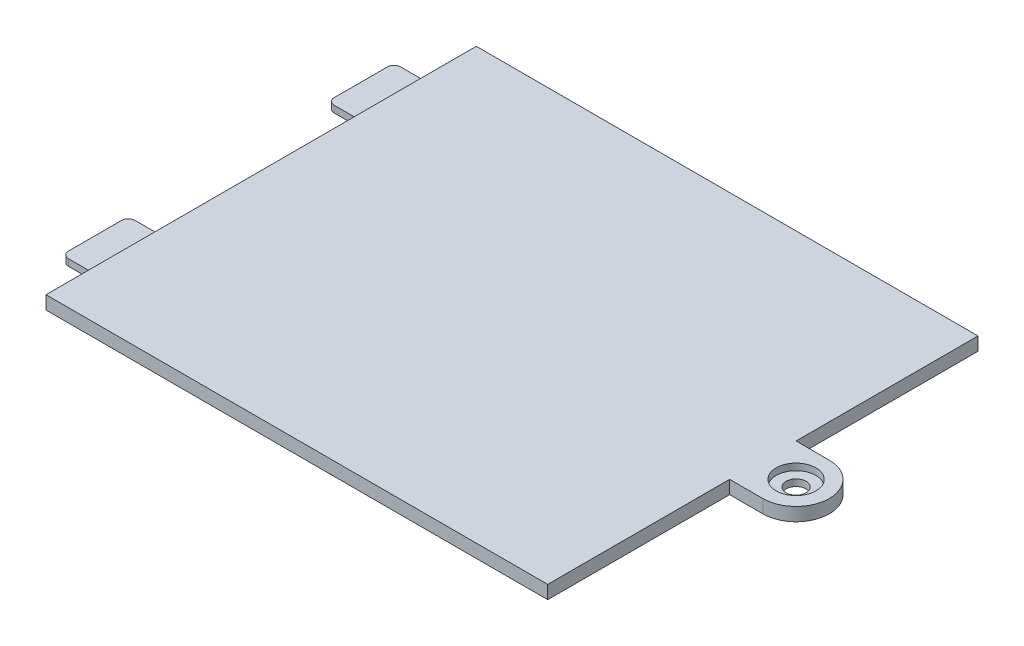
ISO-10303-21;
HEADER;
FILE_DESCRIPTION(('STEP AP214'),'2;1');
FILE_NAME('part.step','',(''),(''),'','','');
FILE_SCHEMA(('AUTOMOTIVE_DESIGN { 1 0 10303 214 1 1 1 1 }'));
ENDSEC;
DATA;
#1=APPLICATION_CONTEXT('core data for automotive mechanical design processes');
#2=APPLICATION_PROTOCOL_DEFINITION('international standard','automotive_design',2000,#1);
#3=PRODUCT_CONTEXT('',#1,'mechanical');
#4=PRODUCT('Part','Part','',(#3));
#5=PRODUCT_RELATED_PRODUCT_CATEGORY('part','',(#4));
#6=PRODUCT_DEFINITION_FORMATION('','',#4);
#7=PRODUCT_DEFINITION_CONTEXT('part definition',#1,'design');
#8=PRODUCT_DEFINITION('design','',#6,#7);
#9=PRODUCT_DEFINITION_SHAPE('','',#8);
#10=(LENGTH_UNIT() NAMED_UNIT(*) SI_UNIT(.MILLI.,.METRE.));
#11=(NAMED_UNIT(*) PLANE_ANGLE_UNIT() SI_UNIT($,.RADIAN.));
#12=(NAMED_UNIT(*) SI_UNIT($,.STERADIAN.) SOLID_ANGLE_UNIT());
#13=UNCERTAINTY_MEASURE_WITH_UNIT(LENGTH_MEASURE(1.E-05),#10,'distance_accuracy_value','');
#14=(GEOMETRIC_REPRESENTATION_CONTEXT(3) GLOBAL_UNCERTAINTY_ASSIGNED_CONTEXT((#13)) GLOBAL_UNIT_ASSIGNED_CONTEXT((#10,
#11,#12)) REPRESENTATION_CONTEXT('',''));
#15=CARTESIAN_POINT('',(0.,0.,0.));
#16=DIRECTION('',(0.,0.,1.));
#17=DIRECTION('',(1.,0.,0.));
#18=AXIS2_PLACEMENT_3D('',#15,#16,#17);
#19=CARTESIAN_POINT('',(42.76,-4.24264068711929,0.));
#20=DIRECTION('',(0.,1.,0.));
#21=DIRECTION('',(0.,0.,1.));
#22=AXIS2_PLACEMENT_3D('',#19,#20,#21);
#23=CYLINDRICAL_SURFACE('',#22,1.5);
#24=CARTESIAN_POINT('',(42.76,0.,0.));
#25=DIRECTION('',(0.,1.,0.));
#26=DIRECTION('',(0.,0.,1.));
#27=AXIS2_PLACEMENT_3D('',#24,#25,#26);
#28=CIRCLE('',#27,1.5);
#29=CARTESIAN_POINT('',(42.76,0.,1.5));
#30=VERTEX_POINT('',#29);
#31=EDGE_CURVE('E208',#30,#30,#28,.F.);
#32=CARTESIAN_POINT('',(42.76,1.,0.));
#33=DIRECTION('',(0.,1.,0.));
#34=DIRECTION('',(0.,0.,1.));
#35=AXIS2_PLACEMENT_3D('',#32,#33,#34);
#36=CIRCLE('',#35,1.5);
#37=CARTESIAN_POINT('',(42.76,1.,1.5));
#38=VERTEX_POINT('',#37);
#39=EDGE_CURVE('E430',#38,#38,#36,.T.);
#40=CARTESIAN_POINT('',(42.76,0.,1.5));
#41=CARTESIAN_POINT('',(42.76,0.0104166666666658,1.5));
#42=CARTESIAN_POINT('',(42.76,0.0208333333333325,1.5));
#43=CARTESIAN_POINT('',(42.76,0.0416666666666658,1.5));
#44=CARTESIAN_POINT('',(42.76,0.0520833333333325,1.5));
#45=CARTESIAN_POINT('',(42.76,0.0729166666666659,1.5));
#46=CARTESIAN_POINT('',(42.76,0.0833333333333325,1.5));
#47=CARTESIAN_POINT('',(42.76,0.104166666666666,1.5));
#48=CARTESIAN_POINT('',(42.76,0.114583333333333,1.5));
#49=CARTESIAN_POINT('',(42.76,0.135416666666666,1.5));
#50=CARTESIAN_POINT('',(42.76,0.145833333333333,1.5));
#51=CARTESIAN_POINT('',(42.76,0.166666666666666,1.5));
#52=CARTESIAN_POINT('',(42.76,0.177083333333333,1.5));
#53=CARTESIAN_POINT('',(42.76,0.197916666666666,1.5));
#54=CARTESIAN_POINT('',(42.76,0.208333333333333,1.5));
#55=CARTESIAN_POINT('',(42.76,0.229166666666666,1.5));
#56=CARTESIAN_POINT('',(42.76,0.239583333333333,1.5));
#57=CARTESIAN_POINT('',(42.76,0.260416666666666,1.5));
#58=CARTESIAN_POINT('',(42.76,0.270833333333333,1.5));
#59=CARTESIAN_POINT('',(42.76,0.291666666666666,1.5));
#60=CARTESIAN_POINT('',(42.76,0.302083333333333,1.5));
#61=CARTESIAN_POINT('',(42.76,0.322916666666666,1.5));
#62=CARTESIAN_POINT('',(42.76,0.333333333333333,1.5));
#63=CARTESIAN_POINT('',(42.76,0.354166666666666,1.5));
#64=CARTESIAN_POINT('',(42.76,0.364583333333333,1.5));
#65=CARTESIAN_POINT('',(42.76,0.385416666666666,1.5));
#66=CARTESIAN_POINT('',(42.76,0.395833333333333,1.5));
#67=CARTESIAN_POINT('',(42.76,0.416666666666666,1.5));
#68=CARTESIAN_POINT('',(42.76,0.427083333333333,1.5));
#69=CARTESIAN_POINT('',(42.76,0.447916666666666,1.5));
#70=CARTESIAN_POINT('',(42.76,0.458333333333333,1.5));
#71=CARTESIAN_POINT('',(42.76,0.479166666666666,1.5));
#72=CARTESIAN_POINT('',(42.76,0.489583333333333,1.5));
#73=CARTESIAN_POINT('',(42.76,0.510416666666666,1.5));
#74=CARTESIAN_POINT('',(42.76,0.520833333333333,1.5));
#75=CARTESIAN_POINT('',(42.76,0.541666666666666,1.5));
#76=CARTESIAN_POINT('',(42.76,0.552083333333333,1.5));
#77=CARTESIAN_POINT('',(42.76,0.572916666666666,1.5));
#78=CARTESIAN_POINT('',(42.76,0.583333333333333,1.5));
#79=CARTESIAN_POINT('',(42.76,0.604166666666666,1.5));
#80=CARTESIAN_POINT('',(42.76,0.614583333333333,1.5));
#81=CARTESIAN_POINT('',(42.76,0.635416666666666,1.5));
#82=CARTESIAN_POINT('',(42.76,0.645833333333333,1.5));
#83=CARTESIAN_POINT('',(42.76,0.666666666666666,1.5));
#84=CARTESIAN_POINT('',(42.76,0.677083333333333,1.5));
#85=CARTESIAN_POINT('',(42.76,0.697916666666666,1.5));
#86=CARTESIAN_POINT('',(42.76,0.708333333333333,1.5));
#87=CARTESIAN_POINT('',(42.76,0.729166666666667,1.5));
#88=CARTESIAN_POINT('',(42.76,0.739583333333333,1.5));
#89=CARTESIAN_POINT('',(42.76,0.760416666666667,1.5));
#90=CARTESIAN_POINT('',(42.76,0.770833333333333,1.5));
#91=CARTESIAN_POINT('',(42.76,0.791666666666667,1.5));
#92=CARTESIAN_POINT('',(42.76,0.802083333333333,1.5));
#93=CARTESIAN_POINT('',(42.76,0.822916666666667,1.5));
#94=CARTESIAN_POINT('',(42.76,0.833333333333333,1.5));
#95=CARTESIAN_POINT('',(42.76,0.854166666666667,1.5));
#96=CARTESIAN_POINT('',(42.76,0.864583333333333,1.5));
#97=CARTESIAN_POINT('',(42.76,0.885416666666667,1.5));
#98=CARTESIAN_POINT('',(42.76,0.895833333333333,1.5));
#99=CARTESIAN_POINT('',(42.76,0.916666666666667,1.5));
#100=CARTESIAN_POINT('',(42.76,0.927083333333333,1.5));
#101=CARTESIAN_POINT('',(42.76,0.947916666666667,1.5));
#102=CARTESIAN_POINT('',(42.76,0.958333333333333,1.5));
#103=CARTESIAN_POINT('',(42.76,0.979166666666667,1.5));
#104=CARTESIAN_POINT('',(42.76,0.989583333333333,1.5));
#105=CARTESIAN_POINT('',(42.76,1.,1.5));
#106=B_SPLINE_CURVE_WITH_KNOTS('',3,(#40,#41,#42,#43,#44,#45,#46,#47,#48,#49,#50,#51,#52,#53,
#54,#55,#56,#57,#58,#59,#60,#61,#62,#63,#64,#65,#66,#67,#68,#69,#70,#71,#72,#73,#74,#75,#76,#77,
#78,#79,#80,#81,#82,#83,#84,#85,#86,#87,#88,#89,#90,#91,#92,#93,#94,#95,#96,#97,#98,#99,#100,
#101,#102,#103,#104,#105),.UNSPECIFIED.,.F.,.F.,(4,2,2,2,2,2,2,2,2,2,2,2,2,2,2,2,2,2,2,2,2,2,2,
2,2,2,2,2,2,2,2,2,4),(0.,0.03125,0.0625000000000001,0.0937500000000001,0.125,0.15625,0.1875,
0.21875,0.25,0.28125,0.3125,0.34375,0.375,0.40625,0.4375,0.46875,0.5,0.53125,0.5625,
0.593750000000001,0.625000000000001,0.656250000000001,0.687500000000001,0.718750000000001,
0.750000000000001,0.781250000000001,0.812500000000001,0.843750000000001,0.875000000000001,
0.906250000000001,0.937500000000001,0.968750000000001,1.),.UNSPECIFIED.);
#107=EDGE_CURVE('BSEAM38',#30,#38,#106,.T.);
#108=ORIENTED_EDGE('',*,*,#31,.T.);
#109=ORIENTED_EDGE('',*,*,#39,.T.);
#110=ORIENTED_EDGE('',*,*,#107,.T.);
#111=ORIENTED_EDGE('',*,*,#107,.F.);
#112=EDGE_LOOP('',(#108,#110,#109,#111));
#113=FACE_BOUND('',#112,.T.);
#114=ADVANCED_FACE('F38',(#113),#23,.F.);
#115=CARTESIAN_POINT('',(-37.76,2.,32.385));
#116=DIRECTION('',(1.,0.,0.));
#117=DIRECTION('',(0.,0.,-1.));
#118=AXIS2_PLACEMENT_3D('',#115,#116,#117);
#119=PLANE('',#118);
#120=DIRECTION('',(0.,1.,0.));
#121=VECTOR('',#120,1.);
#122=CARTESIAN_POINT('',(-37.76,0.,25.));
#123=LINE('',#122,#121);
#124=CARTESIAN_POINT('',(-37.76,0.,25.));
#125=VERTEX_POINT('',#124);
#126=CARTESIAN_POINT('',(-37.76,1.,25.));
#127=VERTEX_POINT('',#126);
#128=EDGE_CURVE('E180',#125,#127,#123,.T.);
#129=ORIENTED_EDGE('',*,*,#128,.F.);
#130=DIRECTION('',(0.,0.,1.));
#131=VECTOR('',#130,1.);
#132=CARTESIAN_POINT('',(-37.76,0.,32.385));
#133=LINE('',#132,#131);
#134=CARTESIAN_POINT('',(-37.76,0.,32.385));
#135=VERTEX_POINT('',#134);
#136=EDGE_CURVE('E190',#125,#135,#133,.T.);
#137=ORIENTED_EDGE('',*,*,#136,.T.);
#138=DIRECTION('',(0.,-1.,0.));
#139=VECTOR('',#138,1.);
#140=CARTESIAN_POINT('',(-37.76,2.,32.385));
#141=LINE('',#140,#139);
#142=CARTESIAN_POINT('',(-37.76,2.,32.385));
#143=VERTEX_POINT('',#142);
#144=EDGE_CURVE('E336',#143,#135,#141,.T.);
#145=ORIENTED_EDGE('',*,*,#144,.F.);
#146=DIRECTION('',(0.,0.,1.));
#147=VECTOR('',#146,1.);
#148=CARTESIAN_POINT('',(-37.76,2.,32.385));
#149=LINE('',#148,#147);
#150=CARTESIAN_POINT('',(-37.76,2.,-32.385));
#151=VERTEX_POINT('',#150);
#152=EDGE_CURVE('E298',#151,#143,#149,.T.);
#153=ORIENTED_EDGE('',*,*,#152,.F.);
#154=DIRECTION('',(0.,-1.,0.));
#155=VECTOR('',#154,1.);
#156=CARTESIAN_POINT('',(-37.76,2.,-32.385));
#157=LINE('',#156,#155);
#158=CARTESIAN_POINT('',(-37.76,0.,-32.385));
#159=VERTEX_POINT('',#158);
#160=EDGE_CURVE('E313',#151,#159,#157,.T.);
#161=ORIENTED_EDGE('',*,*,#160,.T.);
#162=CARTESIAN_POINT('',(-37.76,0.,-25.));
#163=VERTEX_POINT('',#162);
#164=EDGE_CURVE('E201',#159,#163,#133,.T.);
#165=ORIENTED_EDGE('',*,*,#164,.T.);
#166=DIRECTION('',(0.,-1.,0.));
#167=VECTOR('',#166,1.);
#168=CARTESIAN_POINT('',(-37.76,0.,-25.));
#169=LINE('',#168,#167);
#170=CARTESIAN_POINT('',(-37.76,1.,-25.));
#171=VERTEX_POINT('',#170);
#172=EDGE_CURVE('E238',#171,#163,#169,.T.);
#173=ORIENTED_EDGE('',*,*,#172,.F.);
#174=DIRECTION('',(0.,0.,-1.));
#175=VECTOR('',#174,1.);
#176=CARTESIAN_POINT('',(-37.76,1.,-25.));
#177=LINE('',#176,#175);
#178=CARTESIAN_POINT('',(-37.76,1.,-15.));
#179=VERTEX_POINT('',#178);
#180=EDGE_CURVE('E246',#179,#171,#177,.T.);
#181=ORIENTED_EDGE('',*,*,#180,.F.);
#182=DIRECTION('',(0.,1.,0.));
#183=VECTOR('',#182,1.);
#184=CARTESIAN_POINT('',(-37.76,1.,-15.));
#185=LINE('',#184,#183);
#186=CARTESIAN_POINT('',(-37.76,0.,-15.));
#187=VERTEX_POINT('',#186);
#188=EDGE_CURVE('E186',#187,#179,#185,.T.);
#189=ORIENTED_EDGE('',*,*,#188,.F.);
#190=CARTESIAN_POINT('',(-37.76,0.,15.));
#191=VERTEX_POINT('',#190);
#192=EDGE_CURVE('E198',#187,#191,#133,.T.);
#193=ORIENTED_EDGE('',*,*,#192,.T.);
#194=DIRECTION('',(0.,-1.,0.));
#195=VECTOR('',#194,1.);
#196=CARTESIAN_POINT('',(-37.76,1.,15.));
#197=LINE('',#196,#195);
#198=CARTESIAN_POINT('',(-37.76,1.,15.));
#199=VERTEX_POINT('',#198);
#200=EDGE_CURVE('E212',#199,#191,#197,.T.);
#201=ORIENTED_EDGE('',*,*,#200,.F.);
#202=DIRECTION('',(0.,0.,-1.));
#203=VECTOR('',#202,1.);
#204=CARTESIAN_POINT('',(-37.76,1.,25.));
#205=LINE('',#204,#203);
#206=EDGE_CURVE('E206',#127,#199,#205,.T.);
#207=ORIENTED_EDGE('',*,*,#206,.F.);
#208=EDGE_LOOP('',(#129,#137,#145,#153,#161,#165,#173,#181,#189,#193,#201,#207));
#209=FACE_BOUND('',#208,.T.);
#210=ADVANCED_FACE('F203',(#209),#119,.F.);
#211=CARTESIAN_POINT('',(37.76,2.,32.385));
#212=DIRECTION('',(-1.,0.,0.));
#213=DIRECTION('',(0.,0.,1.));
#214=AXIS2_PLACEMENT_3D('',#211,#212,#213);
#215=PLANE('',#214);
#216=DIRECTION('',(0.,1.,0.));
#217=VECTOR('',#216,1.);
#218=CARTESIAN_POINT('',(37.76,-14.1421356237309,-5.));
#219=LINE('',#218,#217);
#220=CARTESIAN_POINT('',(37.76,0.,-5.));
#221=VERTEX_POINT('',#220);
#222=CARTESIAN_POINT('',(37.76,2.,-5.));
#223=VERTEX_POINT('',#222);
#224=EDGE_CURVE('E269',#221,#223,#219,.T.);
#225=ORIENTED_EDGE('',*,*,#224,.F.);
#226=DIRECTION('',(0.,0.,-1.));
#227=VECTOR('',#226,1.);
#228=CARTESIAN_POINT('',(37.76,0.,32.385));
#229=LINE('',#228,#227);
#230=CARTESIAN_POINT('',(37.76,0.,-32.385));
#231=VERTEX_POINT('',#230);
#232=EDGE_CURVE('E319',#221,#231,#229,.T.);
#233=ORIENTED_EDGE('',*,*,#232,.T.);
#234=DIRECTION('',(0.,-1.,0.));
#235=VECTOR('',#234,1.);
#236=CARTESIAN_POINT('',(37.76,2.,-32.385));
#237=LINE('',#236,#235);
#238=CARTESIAN_POINT('',(37.76,2.,-32.385));
#239=VERTEX_POINT('',#238);
#240=EDGE_CURVE('E328',#239,#231,#237,.T.);
#241=ORIENTED_EDGE('',*,*,#240,.F.);
#242=DIRECTION('',(0.,0.,-1.));
#243=VECTOR('',#242,1.);
#244=CARTESIAN_POINT('',(37.76,2.,32.385));
#245=LINE('',#244,#243);
#246=EDGE_CURVE('E306',#223,#239,#245,.T.);
#247=ORIENTED_EDGE('',*,*,#246,.F.);
#248=EDGE_LOOP('',(#225,#233,#241,#247));
#249=FACE_BOUND('',#248,.T.);
#250=ADVANCED_FACE('F415',(#249),#215,.F.);
#251=CARTESIAN_POINT('',(37.76,2.,32.385));
#252=DIRECTION('',(0.,0.,-1.));
#253=DIRECTION('',(-1.,0.,0.));
#254=AXIS2_PLACEMENT_3D('',#251,#252,#253);
#255=PLANE('',#254);
#256=DIRECTION('',(1.,0.,0.));
#257=VECTOR('',#256,1.);
#258=CARTESIAN_POINT('',(37.76,0.,32.385));
#259=LINE('',#258,#257);
#260=CARTESIAN_POINT('',(37.76,0.,32.385));
#261=VERTEX_POINT('',#260);
#262=EDGE_CURVE('E193',#135,#261,#259,.T.);
#263=ORIENTED_EDGE('',*,*,#262,.T.);
#264=DIRECTION('',(0.,-1.,0.));
#265=VECTOR('',#264,1.);
#266=CARTESIAN_POINT('',(37.76,2.,32.385));
#267=LINE('',#266,#265);
#268=CARTESIAN_POINT('',(37.76,2.,32.385));
#269=VERTEX_POINT('',#268);
#270=EDGE_CURVE('E332',#269,#261,#267,.T.);
#271=ORIENTED_EDGE('',*,*,#270,.F.);
#272=DIRECTION('',(1.,0.,0.));
#273=VECTOR('',#272,1.);
#274=CARTESIAN_POINT('',(37.76,2.,32.385));
#275=LINE('',#274,#273);
#276=EDGE_CURVE('E302',#143,#269,#275,.T.);
#277=ORIENTED_EDGE('',*,*,#276,.F.);
#278=ORIENTED_EDGE('',*,*,#144,.T.);
#279=EDGE_LOOP('',(#263,#271,#277,#278));
#280=FACE_BOUND('',#279,.T.);
#281=ADVANCED_FACE('F459',(#280),#255,.F.);
#282=CARTESIAN_POINT('',(37.76,0.,5.));
#283=VERTEX_POINT('',#282);
#284=EDGE_CURVE('E320',#261,#283,#229,.T.);
#285=ORIENTED_EDGE('',*,*,#284,.T.);
#286=DIRECTION('',(0.,1.,0.));
#287=VECTOR('',#286,1.);
#288=CARTESIAN_POINT('',(37.76,-14.1421356237309,5.));
#289=LINE('',#288,#287);
#290=CARTESIAN_POINT('',(37.76,2.,5.));
#291=VERTEX_POINT('',#290);
#292=EDGE_CURVE('E283',#283,#291,#289,.T.);
#293=ORIENTED_EDGE('',*,*,#292,.T.);
#294=EDGE_CURVE('E307',#269,#291,#245,.T.);
#295=ORIENTED_EDGE('',*,*,#294,.F.);
#296=ORIENTED_EDGE('',*,*,#270,.T.);
#297=EDGE_LOOP('',(#285,#293,#295,#296));
#298=FACE_BOUND('',#297,.T.);
#299=ADVANCED_FACE('F462',(#298),#215,.F.);
#300=CARTESIAN_POINT('',(37.76,2.,-32.385));
#301=DIRECTION('',(0.,0.,1.));
#302=DIRECTION('',(1.,0.,0.));
#303=AXIS2_PLACEMENT_3D('',#300,#301,#302);
#304=PLANE('',#303);
#305=DIRECTION('',(-1.,0.,0.));
#306=VECTOR('',#305,1.);
#307=CARTESIAN_POINT('',(37.76,0.,-32.385));
#308=LINE('',#307,#306);
#309=EDGE_CURVE('E303',#231,#159,#308,.T.);
#310=ORIENTED_EDGE('',*,*,#309,.T.);
#311=ORIENTED_EDGE('',*,*,#160,.F.);
#312=DIRECTION('',(-1.,0.,0.));
#313=VECTOR('',#312,1.);
#314=CARTESIAN_POINT('',(37.76,2.,-32.385));
#315=LINE('',#314,#313);
#316=EDGE_CURVE('E311',#239,#151,#315,.T.);
#317=ORIENTED_EDGE('',*,*,#316,.F.);
#318=ORIENTED_EDGE('',*,*,#240,.T.);
#319=EDGE_LOOP('',(#310,#311,#317,#318));
#320=FACE_BOUND('',#319,.T.);
#321=ADVANCED_FACE('F411',(#320),#304,.F.);
#322=CARTESIAN_POINT('',(0.,2.,0.));
#323=DIRECTION('',(0.,1.,0.));
#324=DIRECTION('',(0.,0.,1.));
#325=AXIS2_PLACEMENT_3D('',#322,#323,#324);
#326=PLANE('',#325);
#327=CARTESIAN_POINT('',(42.76,2.,0.));
#328=DIRECTION('',(0.,1.,0.));
#329=DIRECTION('',(0.,0.,1.));
#330=AXIS2_PLACEMENT_3D('',#327,#328,#329);
#331=CIRCLE('',#330,3.);
#332=CARTESIAN_POINT('',(42.76,2.,3.));
#333=VERTEX_POINT('',#332);
#334=EDGE_CURVE('E426',#333,#333,#331,.T.);
#335=ORIENTED_EDGE('',*,*,#334,.F.);
#336=EDGE_LOOP('',(#335));
#337=FACE_BOUND('',#336,.T.);
#338=ORIENTED_EDGE('',*,*,#152,.T.);
#339=ORIENTED_EDGE('',*,*,#276,.T.);
#340=ORIENTED_EDGE('',*,*,#294,.T.);
#341=DIRECTION('',(1.,0.,0.));
#342=VECTOR('',#341,1.);
#343=CARTESIAN_POINT('',(42.76,2.,5.));
#344=LINE('',#343,#342);
#345=CARTESIAN_POINT('',(42.76,2.,5.));
#346=VERTEX_POINT('',#345);
#347=EDGE_CURVE('E264',#291,#346,#344,.T.);
#348=ORIENTED_EDGE('',*,*,#347,.T.);
#349=CARTESIAN_POINT('',(42.76,2.,0.));
#350=DIRECTION('',(0.,1.,0.));
#351=DIRECTION('',(0.,0.,-1.));
#352=AXIS2_PLACEMENT_3D('',#349,#350,#351);
#353=CIRCLE('',#352,5.);
#354=CARTESIAN_POINT('',(42.76,2.,-5.));
#355=VERTEX_POINT('',#354);
#356=EDGE_CURVE('E275',#346,#355,#353,.T.);
#357=ORIENTED_EDGE('',*,*,#356,.T.);
#358=DIRECTION('',(-1.,0.,0.));
#359=VECTOR('',#358,1.);
#360=CARTESIAN_POINT('',(37.76,2.,-5.));
#361=LINE('',#360,#359);
#362=EDGE_CURVE('E279',#355,#223,#361,.T.);
#363=ORIENTED_EDGE('',*,*,#362,.T.);
#364=ORIENTED_EDGE('',*,*,#246,.T.);
#365=ORIENTED_EDGE('',*,*,#316,.T.);
#366=EDGE_LOOP('',(#338,#339,#340,#348,#357,#363,#364,#365));
#367=FACE_BOUND('',#366,.T.);
#368=ADVANCED_FACE('F453',(#337,#367),#326,.T.);
#369=CARTESIAN_POINT('',(0.,0.,0.));
#370=DIRECTION('',(0.,1.,0.));
#371=DIRECTION('',(0.,0.,1.));
#372=AXIS2_PLACEMENT_3D('',#369,#370,#371);
#373=PLANE('',#372);
#374=ORIENTED_EDGE('',*,*,#31,.F.);
#375=EDGE_LOOP('',(#374));
#376=FACE_BOUND('',#375,.T.);
#377=DIRECTION('',(1.,0.,0.));
#378=VECTOR('',#377,1.);
#379=CARTESIAN_POINT('',(-42.76,0.,25.));
#380=LINE('',#379,#378);
#381=CARTESIAN_POINT('',(-41.76,0.,25.));
#382=VERTEX_POINT('',#381);
#383=EDGE_CURVE('E175',#382,#125,#380,.T.);
#384=ORIENTED_EDGE('',*,*,#383,.F.);
#385=CARTESIAN_POINT('',(-41.76,0.,24.));
#386=DIRECTION('',(0.,1.,0.));
#387=DIRECTION('',(0.,0.,1.));
#388=AXIS2_PLACEMENT_3D('',#385,#386,#387);
#389=CIRCLE('',#388,1.);
#390=CARTESIAN_POINT('',(-42.76,0.,24.));
#391=VERTEX_POINT('',#390);
#392=EDGE_CURVE('E364',#382,#391,#389,.F.);
#393=ORIENTED_EDGE('',*,*,#392,.T.);
#394=DIRECTION('',(0.,0.,1.));
#395=VECTOR('',#394,1.);
#396=CARTESIAN_POINT('',(-42.76,0.,25.));
#397=LINE('',#396,#395);
#398=CARTESIAN_POINT('',(-42.76,0.,16.));
#399=VERTEX_POINT('',#398);
#400=EDGE_CURVE('E224',#399,#391,#397,.T.);
#401=ORIENTED_EDGE('',*,*,#400,.F.);
#402=CARTESIAN_POINT('',(-41.76,0.,16.));
#403=DIRECTION('',(0.,1.,0.));
#404=DIRECTION('',(0.,0.,1.));
#405=AXIS2_PLACEMENT_3D('',#402,#403,#404);
#406=CIRCLE('',#405,1.);
#407=CARTESIAN_POINT('',(-41.76,0.,15.));
#408=VERTEX_POINT('',#407);
#409=EDGE_CURVE('E361',#399,#408,#406,.F.);
#410=ORIENTED_EDGE('',*,*,#409,.T.);
#411=DIRECTION('',(1.,0.,0.));
#412=VECTOR('',#411,1.);
#413=CARTESIAN_POINT('',(-42.76,0.,15.));
#414=LINE('',#413,#412);
#415=EDGE_CURVE('E225',#408,#191,#414,.T.);
#416=ORIENTED_EDGE('',*,*,#415,.T.);
#417=ORIENTED_EDGE('',*,*,#192,.F.);
#418=DIRECTION('',(1.,0.,0.));
#419=VECTOR('',#418,1.);
#420=CARTESIAN_POINT('',(-42.76,0.,-15.));
#421=LINE('',#420,#419);
#422=CARTESIAN_POINT('',(-41.76,0.,-15.));
#423=VERTEX_POINT('',#422);
#424=EDGE_CURVE('E261',#423,#187,#421,.T.);
#425=ORIENTED_EDGE('',*,*,#424,.F.);
#426=CARTESIAN_POINT('',(-41.76,0.,-16.));
#427=DIRECTION('',(0.,1.,0.));
#428=DIRECTION('',(0.,0.,1.));
#429=AXIS2_PLACEMENT_3D('',#426,#427,#428);
#430=CIRCLE('',#429,1.);
#431=CARTESIAN_POINT('',(-42.76,0.,-16.));
#432=VERTEX_POINT('',#431);
#433=EDGE_CURVE('E358',#423,#432,#430,.F.);
#434=ORIENTED_EDGE('',*,*,#433,.T.);
#435=DIRECTION('',(0.,0.,1.));
#436=VECTOR('',#435,1.);
#437=CARTESIAN_POINT('',(-42.76,0.,-25.));
#438=LINE('',#437,#436);
#439=CARTESIAN_POINT('',(-42.76,0.,-24.));
#440=VERTEX_POINT('',#439);
#441=EDGE_CURVE('E233',#440,#432,#438,.T.);
#442=ORIENTED_EDGE('',*,*,#441,.F.);
#443=CARTESIAN_POINT('',(-41.76,0.,-24.));
#444=DIRECTION('',(0.,1.,0.));
#445=DIRECTION('',(0.,0.,1.));
#446=AXIS2_PLACEMENT_3D('',#443,#444,#445);
#447=CIRCLE('',#446,1.);
#448=CARTESIAN_POINT('',(-41.76,0.,-25.));
#449=VERTEX_POINT('',#448);
#450=EDGE_CURVE('E355',#440,#449,#447,.F.);
#451=ORIENTED_EDGE('',*,*,#450,.T.);
#452=DIRECTION('',(1.,0.,0.));
#453=VECTOR('',#452,1.);
#454=CARTESIAN_POINT('',(-42.76,0.,-25.));
#455=LINE('',#454,#453);
#456=EDGE_CURVE('E242',#449,#163,#455,.T.);
#457=ORIENTED_EDGE('',*,*,#456,.T.);
#458=ORIENTED_EDGE('',*,*,#164,.F.);
#459=ORIENTED_EDGE('',*,*,#309,.F.);
#460=ORIENTED_EDGE('',*,*,#232,.F.);
#461=DIRECTION('',(1.,0.,0.));
#462=VECTOR('',#461,1.);
#463=CARTESIAN_POINT('',(37.76,0.,-5.));
#464=LINE('',#463,#462);
#465=CARTESIAN_POINT('',(42.76,0.,-5.));
#466=VERTEX_POINT('',#465);
#467=EDGE_CURVE('E268',#221,#466,#464,.T.);
#468=ORIENTED_EDGE('',*,*,#467,.T.);
#469=CARTESIAN_POINT('',(42.76,0.,0.));
#470=DIRECTION('',(0.,1.,0.));
#471=DIRECTION('',(0.,0.,1.));
#472=AXIS2_PLACEMENT_3D('',#469,#470,#471);
#473=CIRCLE('',#472,5.);
#474=CARTESIAN_POINT('',(42.76,0.,5.));
#475=VERTEX_POINT('',#474);
#476=EDGE_CURVE('E265',#466,#475,#473,.F.);
#477=ORIENTED_EDGE('',*,*,#476,.T.);
#478=DIRECTION('',(-1.,0.,0.));
#479=VECTOR('',#478,1.);
#480=CARTESIAN_POINT('',(42.76,0.,5.));
#481=LINE('',#480,#479);
#482=EDGE_CURVE('E199',#475,#283,#481,.T.);
#483=ORIENTED_EDGE('',*,*,#482,.T.);
#484=ORIENTED_EDGE('',*,*,#284,.F.);
#485=ORIENTED_EDGE('',*,*,#262,.F.);
#486=ORIENTED_EDGE('',*,*,#136,.F.);
#487=EDGE_LOOP('',(#384,#393,#401,#410,#416,#417,#425,#434,#442,#451,#457,#458,#459,#460,#468,
#477,#483,#484,#485,#486));
#488=FACE_BOUND('',#487,.T.);
#489=ADVANCED_FACE('F191',(#376,#488),#373,.F.);
#490=CARTESIAN_POINT('',(37.76,-14.1421356237309,-5.));
#491=DIRECTION('',(0.,0.,-1.));
#492=DIRECTION('',(-1.,0.,0.));
#493=AXIS2_PLACEMENT_3D('',#490,#491,#492);
#494=PLANE('',#493);
#495=ORIENTED_EDGE('',*,*,#467,.F.);
#496=ORIENTED_EDGE('',*,*,#224,.T.);
#497=ORIENTED_EDGE('',*,*,#362,.F.);
#498=DIRECTION('',(0.,1.,0.));
#499=VECTOR('',#498,1.);
#500=CARTESIAN_POINT('',(42.76,-14.1421356237309,-5.));
#501=LINE('',#500,#499);
#502=EDGE_CURVE('E287',#466,#355,#501,.T.);
#503=ORIENTED_EDGE('',*,*,#502,.F.);
#504=EDGE_LOOP('',(#495,#496,#497,#503));
#505=FACE_BOUND('',#504,.T.);
#506=ADVANCED_FACE('F476',(#505),#494,.T.);
#507=CARTESIAN_POINT('',(42.76,-14.1421356237309,0.));
#508=DIRECTION('',(0.,1.,0.));
#509=DIRECTION('',(0.,0.,1.));
#510=AXIS2_PLACEMENT_3D('',#507,#508,#509);
#511=CYLINDRICAL_SURFACE('',#510,5.);
#512=ORIENTED_EDGE('',*,*,#476,.F.);
#513=ORIENTED_EDGE('',*,*,#502,.T.);
#514=ORIENTED_EDGE('',*,*,#356,.F.);
#515=DIRECTION('',(0.,1.,0.));
#516=VECTOR('',#515,1.);
#517=CARTESIAN_POINT('',(42.76,-14.1421356237309,5.));
#518=LINE('',#517,#516);
#519=EDGE_CURVE('E290',#475,#346,#518,.T.);
#520=ORIENTED_EDGE('',*,*,#519,.F.);
#521=EDGE_LOOP('',(#512,#513,#514,#520));
#522=FACE_BOUND('',#521,.T.);
#523=ADVANCED_FACE('F472',(#522),#511,.T.);
#524=CARTESIAN_POINT('',(42.76,-14.1421356237309,5.));
#525=DIRECTION('',(0.,0.,1.));
#526=DIRECTION('',(1.,0.,0.));
#527=AXIS2_PLACEMENT_3D('',#524,#525,#526);
#528=PLANE('',#527);
#529=ORIENTED_EDGE('',*,*,#482,.F.);
#530=ORIENTED_EDGE('',*,*,#519,.T.);
#531=ORIENTED_EDGE('',*,*,#347,.F.);
#532=ORIENTED_EDGE('',*,*,#292,.F.);
#533=EDGE_LOOP('',(#529,#530,#531,#532));
#534=FACE_BOUND('',#533,.T.);
#535=ADVANCED_FACE('F467',(#534),#528,.T.);
#536=CARTESIAN_POINT('',(-42.76,1.,-15.));
#537=DIRECTION('',(0.,0.,-1.));
#538=DIRECTION('',(-1.,0.,0.));
#539=AXIS2_PLACEMENT_3D('',#536,#537,#538);
#540=PLANE('',#539);
#541=DIRECTION('',(1.,0.,0.));
#542=VECTOR('',#541,1.);
#543=CARTESIAN_POINT('',(-42.76,1.,-15.));
#544=LINE('',#543,#542);
#545=CARTESIAN_POINT('',(-41.76,1.,-15.));
#546=VERTEX_POINT('',#545);
#547=EDGE_CURVE('E258',#546,#179,#544,.T.);
#548=ORIENTED_EDGE('',*,*,#547,.F.);
#549=DIRECTION('',(0.,1.,0.));
#550=VECTOR('',#549,1.);
#551=CARTESIAN_POINT('',(-41.76,1.,-15.));
#552=LINE('',#551,#550);
#553=EDGE_CURVE('E47',#546,#423,#552,.F.);
#554=ORIENTED_EDGE('',*,*,#553,.T.);
#555=ORIENTED_EDGE('',*,*,#424,.T.);
#556=ORIENTED_EDGE('',*,*,#188,.T.);
#557=EDGE_LOOP('',(#548,#554,#555,#556));
#558=FACE_BOUND('',#557,.T.);
#559=ADVANCED_FACE('F386',(#558),#540,.F.);
#560=CARTESIAN_POINT('',(-42.76,1.,-25.));
#561=DIRECTION('',(0.,-1.,0.));
#562=DIRECTION('',(0.,0.,-1.));
#563=AXIS2_PLACEMENT_3D('',#560,#561,#562);
#564=PLANE('',#563);
#565=DIRECTION('',(0.,0.,-1.));
#566=VECTOR('',#565,1.);
#567=CARTESIAN_POINT('',(-42.76,1.,-25.));
#568=LINE('',#567,#566);
#569=CARTESIAN_POINT('',(-42.76,1.,-16.));
#570=VERTEX_POINT('',#569);
#571=CARTESIAN_POINT('',(-42.76,1.,-24.));
#572=VERTEX_POINT('',#571);
#573=EDGE_CURVE('E237',#570,#572,#568,.T.);
#574=ORIENTED_EDGE('',*,*,#573,.F.);
#575=CARTESIAN_POINT('',(-41.76,1.,-16.));
#576=DIRECTION('',(0.,-1.,0.));
#577=DIRECTION('',(0.,0.,-1.));
#578=AXIS2_PLACEMENT_3D('',#575,#576,#577);
#579=CIRCLE('',#578,1.);
#580=EDGE_CURVE('E54',#570,#546,#579,.F.);
#581=ORIENTED_EDGE('',*,*,#580,.T.);
#582=ORIENTED_EDGE('',*,*,#547,.T.);
#583=ORIENTED_EDGE('',*,*,#180,.T.);
#584=DIRECTION('',(1.,0.,0.));
#585=VECTOR('',#584,1.);
#586=CARTESIAN_POINT('',(-42.76,1.,-25.));
#587=LINE('',#586,#585);
#588=CARTESIAN_POINT('',(-41.76,1.,-25.));
#589=VERTEX_POINT('',#588);
#590=EDGE_CURVE('E255',#589,#171,#587,.T.);
#591=ORIENTED_EDGE('',*,*,#590,.F.);
#592=CARTESIAN_POINT('',(-41.76,1.,-24.));
#593=DIRECTION('',(0.,-1.,0.));
#594=DIRECTION('',(0.,0.,-1.));
#595=AXIS2_PLACEMENT_3D('',#592,#593,#594);
#596=CIRCLE('',#595,1.);
#597=EDGE_CURVE('E378',#589,#572,#596,.F.);
#598=ORIENTED_EDGE('',*,*,#597,.T.);
#599=EDGE_LOOP('',(#574,#581,#582,#583,#591,#598));
#600=FACE_BOUND('',#599,.T.);
#601=ADVANCED_FACE('F398',(#600),#564,.F.);
#602=CARTESIAN_POINT('',(-42.76,0.,-25.));
#603=DIRECTION('',(0.,0.,1.));
#604=DIRECTION('',(1.,0.,0.));
#605=AXIS2_PLACEMENT_3D('',#602,#603,#604);
#606=PLANE('',#605);
#607=ORIENTED_EDGE('',*,*,#456,.F.);
#608=DIRECTION('',(0.,-1.,0.));
#609=VECTOR('',#608,1.);
#610=CARTESIAN_POINT('',(-41.76,0.,-25.));
#611=LINE('',#610,#609);
#612=EDGE_CURVE('E11',#449,#589,#611,.F.);
#613=ORIENTED_EDGE('',*,*,#612,.T.);
#614=ORIENTED_EDGE('',*,*,#590,.T.);
#615=ORIENTED_EDGE('',*,*,#172,.T.);
#616=EDGE_LOOP('',(#607,#613,#614,#615));
#617=FACE_BOUND('',#616,.T.);
#618=ADVANCED_FACE('F402',(#617),#606,.F.);
#619=CARTESIAN_POINT('',(-42.76,0.,0.));
#620=DIRECTION('',(1.,0.,0.));
#621=DIRECTION('',(0.,0.,-1.));
#622=AXIS2_PLACEMENT_3D('',#619,#620,#621);
#623=PLANE('',#622);
#624=ORIENTED_EDGE('',*,*,#441,.T.);
#625=DIRECTION('',(0.,1.,0.));
#626=VECTOR('',#625,1.);
#627=CARTESIAN_POINT('',(-42.76,0.,-16.));
#628=LINE('',#627,#626);
#629=EDGE_CURVE('E374',#432,#570,#628,.T.);
#630=ORIENTED_EDGE('',*,*,#629,.T.);
#631=ORIENTED_EDGE('',*,*,#573,.T.);
#632=DIRECTION('',(0.,-1.,0.));
#633=VECTOR('',#632,1.);
#634=CARTESIAN_POINT('',(-42.76,0.,-24.));
#635=LINE('',#634,#633);
#636=EDGE_CURVE('E370',#572,#440,#635,.T.);
#637=ORIENTED_EDGE('',*,*,#636,.T.);
#638=EDGE_LOOP('',(#624,#630,#631,#637));
#639=FACE_BOUND('',#638,.T.);
#640=ADVANCED_FACE('F396',(#639),#623,.F.);
#641=CARTESIAN_POINT('',(-42.76,0.,25.));
#642=DIRECTION('',(0.,0.,-1.));
#643=DIRECTION('',(-1.,0.,0.));
#644=AXIS2_PLACEMENT_3D('',#641,#642,#643);
#645=PLANE('',#644);
#646=DIRECTION('',(1.,0.,0.));
#647=VECTOR('',#646,1.);
#648=CARTESIAN_POINT('',(-42.76,1.,25.));
#649=LINE('',#648,#647);
#650=CARTESIAN_POINT('',(-41.76,1.,25.));
#651=VERTEX_POINT('',#650);
#652=EDGE_CURVE('E187',#651,#127,#649,.T.);
#653=ORIENTED_EDGE('',*,*,#652,.F.);
#654=DIRECTION('',(0.,1.,0.));
#655=VECTOR('',#654,1.);
#656=CARTESIAN_POINT('',(-41.76,0.,25.));
#657=LINE('',#656,#655);
#658=EDGE_CURVE('E182',#651,#382,#657,.F.);
#659=ORIENTED_EDGE('',*,*,#658,.T.);
#660=ORIENTED_EDGE('',*,*,#383,.T.);
#661=ORIENTED_EDGE('',*,*,#128,.T.);
#662=EDGE_LOOP('',(#653,#659,#660,#661));
#663=FACE_BOUND('',#662,.T.);
#664=ADVANCED_FACE('F178',(#663),#645,.F.);
#665=CARTESIAN_POINT('',(-42.76,1.,25.));
#666=DIRECTION('',(0.,-1.,0.));
#667=DIRECTION('',(0.,0.,-1.));
#668=AXIS2_PLACEMENT_3D('',#665,#666,#667);
#669=PLANE('',#668);
#670=DIRECTION('',(0.,0.,-1.));
#671=VECTOR('',#670,1.);
#672=CARTESIAN_POINT('',(-42.76,1.,25.));
#673=LINE('',#672,#671);
#674=CARTESIAN_POINT('',(-42.76,1.,24.));
#675=VERTEX_POINT('',#674);
#676=CARTESIAN_POINT('',(-42.76,1.,16.));
#677=VERTEX_POINT('',#676);
#678=EDGE_CURVE('E218',#675,#677,#673,.T.);
#679=ORIENTED_EDGE('',*,*,#678,.F.);
#680=CARTESIAN_POINT('',(-41.76,1.,24.));
#681=DIRECTION('',(0.,-1.,0.));
#682=DIRECTION('',(0.,0.,-1.));
#683=AXIS2_PLACEMENT_3D('',#680,#681,#682);
#684=CIRCLE('',#683,1.);
#685=EDGE_CURVE('E350',#675,#651,#684,.F.);
#686=ORIENTED_EDGE('',*,*,#685,.T.);
#687=ORIENTED_EDGE('',*,*,#652,.T.);
#688=ORIENTED_EDGE('',*,*,#206,.T.);
#689=DIRECTION('',(1.,0.,0.));
#690=VECTOR('',#689,1.);
#691=CARTESIAN_POINT('',(-42.76,1.,15.));
#692=LINE('',#691,#690);
#693=CARTESIAN_POINT('',(-41.76,1.,15.));
#694=VERTEX_POINT('',#693);
#695=EDGE_CURVE('E228',#694,#199,#692,.T.);
#696=ORIENTED_EDGE('',*,*,#695,.F.);
#697=CARTESIAN_POINT('',(-41.76,1.,16.));
#698=DIRECTION('',(0.,-1.,0.));
#699=DIRECTION('',(0.,0.,-1.));
#700=AXIS2_PLACEMENT_3D('',#697,#698,#699);
#701=CIRCLE('',#700,1.);
#702=EDGE_CURVE('E347',#694,#677,#701,.F.);
#703=ORIENTED_EDGE('',*,*,#702,.T.);
#704=EDGE_LOOP('',(#679,#686,#687,#688,#696,#703));
#705=FACE_BOUND('',#704,.T.);
#706=ADVANCED_FACE('F500',(#705),#669,.F.);
#707=CARTESIAN_POINT('',(-42.76,1.,15.));
#708=DIRECTION('',(0.,0.,1.));
#709=DIRECTION('',(1.,0.,0.));
#710=AXIS2_PLACEMENT_3D('',#707,#708,#709);
#711=PLANE('',#710);
#712=ORIENTED_EDGE('',*,*,#415,.F.);
#713=DIRECTION('',(0.,-1.,0.));
#714=VECTOR('',#713,1.);
#715=CARTESIAN_POINT('',(-41.76,1.,15.));
#716=LINE('',#715,#714);
#717=EDGE_CURVE('E367',#408,#694,#716,.F.);
#718=ORIENTED_EDGE('',*,*,#717,.T.);
#719=ORIENTED_EDGE('',*,*,#695,.T.);
#720=ORIENTED_EDGE('',*,*,#200,.T.);
#721=EDGE_LOOP('',(#712,#718,#719,#720));
#722=FACE_BOUND('',#721,.T.);
#723=ADVANCED_FACE('F497',(#722),#711,.F.);
#724=CARTESIAN_POINT('',(-42.76,0.,0.));
#725=DIRECTION('',(-1.,0.,0.));
#726=DIRECTION('',(0.,0.,1.));
#727=AXIS2_PLACEMENT_3D('',#724,#725,#726);
#728=PLANE('',#727);
#729=ORIENTED_EDGE('',*,*,#400,.T.);
#730=DIRECTION('',(0.,1.,0.));
#731=VECTOR('',#730,1.);
#732=CARTESIAN_POINT('',(-42.76,1.,24.));
#733=LINE('',#732,#731);
#734=EDGE_CURVE('E343',#391,#675,#733,.T.);
#735=ORIENTED_EDGE('',*,*,#734,.T.);
#736=ORIENTED_EDGE('',*,*,#678,.T.);
#737=DIRECTION('',(0.,-1.,0.));
#738=VECTOR('',#737,1.);
#739=CARTESIAN_POINT('',(-42.76,0.,16.));
#740=LINE('',#739,#738);
#741=EDGE_CURVE('E339',#677,#399,#740,.T.);
#742=ORIENTED_EDGE('',*,*,#741,.T.);
#743=EDGE_LOOP('',(#729,#735,#736,#742));
#744=FACE_BOUND('',#743,.T.);
#745=ADVANCED_FACE('F449',(#744),#728,.T.);
#746=CARTESIAN_POINT('',(42.76,1.,0.));
#747=DIRECTION('',(0.,1.,0.));
#748=DIRECTION('',(0.,0.,1.));
#749=AXIS2_PLACEMENT_3D('',#746,#747,#748);
#750=CYLINDRICAL_SURFACE('',#749,3.);
#751=CARTESIAN_POINT('',(42.76,1.,0.));
#752=DIRECTION('',(0.,1.,0.));
#753=DIRECTION('',(0.,0.,1.));
#754=AXIS2_PLACEMENT_3D('',#751,#752,#753);
#755=CIRCLE('',#754,3.);
#756=CARTESIAN_POINT('',(42.76,1.,3.));
#757=VERTEX_POINT('',#756);
#758=EDGE_CURVE('E215',#757,#757,#755,.T.);
#759=ORIENTED_EDGE('',*,*,#758,.F.);
#760=EDGE_LOOP('',(#759));
#761=FACE_BOUND('',#760,.T.);
#762=ORIENTED_EDGE('',*,*,#334,.T.);
#763=EDGE_LOOP('',(#762));
#764=FACE_BOUND('',#763,.T.);
#765=ADVANCED_FACE('F443',(#761,#764),#750,.F.);
#766=CARTESIAN_POINT('',(42.76,1.,0.));
#767=DIRECTION('',(0.,1.,0.));
#768=DIRECTION('',(0.,0.,1.));
#769=AXIS2_PLACEMENT_3D('',#766,#767,#768);
#770=PLANE('',#769);
#771=ORIENTED_EDGE('',*,*,#39,.F.);
#772=EDGE_LOOP('',(#771));
#773=FACE_BOUND('',#772,.T.);
#774=ORIENTED_EDGE('',*,*,#758,.T.);
#775=EDGE_LOOP('',(#774));
#776=FACE_BOUND('',#775,.T.);
#777=ADVANCED_FACE('F439',(#773,#776),#770,.T.);
#778=CARTESIAN_POINT('',(-41.76,0.,24.));
#779=DIRECTION('',(0.,-1.,0.));
#780=DIRECTION('',(0.,0.,-1.));
#781=AXIS2_PLACEMENT_3D('',#778,#779,#780);
#782=CYLINDRICAL_SURFACE('',#781,1.);
#783=ORIENTED_EDGE('',*,*,#392,.F.);
#784=ORIENTED_EDGE('',*,*,#658,.F.);
#785=ORIENTED_EDGE('',*,*,#685,.F.);
#786=ORIENTED_EDGE('',*,*,#734,.F.);
#787=EDGE_LOOP('',(#783,#784,#785,#786));
#788=FACE_BOUND('',#787,.T.);
#789=ADVANCED_FACE('F442',(#788),#782,.T.);
#790=CARTESIAN_POINT('',(-41.76,0.,16.));
#791=DIRECTION('',(0.,1.,0.));
#792=DIRECTION('',(0.,0.,1.));
#793=AXIS2_PLACEMENT_3D('',#790,#791,#792);
#794=CYLINDRICAL_SURFACE('',#793,1.);
#795=ORIENTED_EDGE('',*,*,#702,.F.);
#796=ORIENTED_EDGE('',*,*,#717,.F.);
#797=ORIENTED_EDGE('',*,*,#409,.F.);
#798=ORIENTED_EDGE('',*,*,#741,.F.);
#799=EDGE_LOOP('',(#795,#796,#797,#798));
#800=FACE_BOUND('',#799,.T.);
#801=ADVANCED_FACE('F528',(#800),#794,.T.);
#802=CARTESIAN_POINT('',(-41.76,0.,-16.));
#803=DIRECTION('',(0.,1.,0.));
#804=DIRECTION('',(0.,0.,1.));
#805=AXIS2_PLACEMENT_3D('',#802,#803,#804);
#806=CYLINDRICAL_SURFACE('',#805,1.);
#807=ORIENTED_EDGE('',*,*,#433,.F.);
#808=ORIENTED_EDGE('',*,*,#553,.F.);
#809=ORIENTED_EDGE('',*,*,#580,.F.);
#810=ORIENTED_EDGE('',*,*,#629,.F.);
#811=EDGE_LOOP('',(#807,#808,#809,#810));
#812=FACE_BOUND('',#811,.T.);
#813=ADVANCED_FACE('F394',(#812),#806,.T.);
#814=CARTESIAN_POINT('',(-41.76,0.,-24.));
#815=DIRECTION('',(0.,-1.,0.));
#816=DIRECTION('',(0.,0.,-1.));
#817=AXIS2_PLACEMENT_3D('',#814,#815,#816);
#818=CYLINDRICAL_SURFACE('',#817,1.);
#819=ORIENTED_EDGE('',*,*,#597,.F.);
#820=ORIENTED_EDGE('',*,*,#612,.F.);
#821=ORIENTED_EDGE('',*,*,#450,.F.);
#822=ORIENTED_EDGE('',*,*,#636,.F.);
#823=EDGE_LOOP('',(#819,#820,#821,#822));
#824=FACE_BOUND('',#823,.T.);
#825=ADVANCED_FACE('F40',(#824),#818,.T.);
#826=CLOSED_SHELL('',(#114,#210,#250,#281,#299,#321,#368,#489,#506,#523,#535,#559,#601,#618,
#640,#664,#706,#723,#745,#765,#777,#789,#801,#813,#825));
#827=MANIFOLD_SOLID_BREP('B2',#826);
#828=ADVANCED_BREP_SHAPE_REPRESENTATION('',(#18,#827),#14);
#829=SHAPE_DEFINITION_REPRESENTATION(#9,#828);
ENDSEC;
END-ISO-10303-21;
